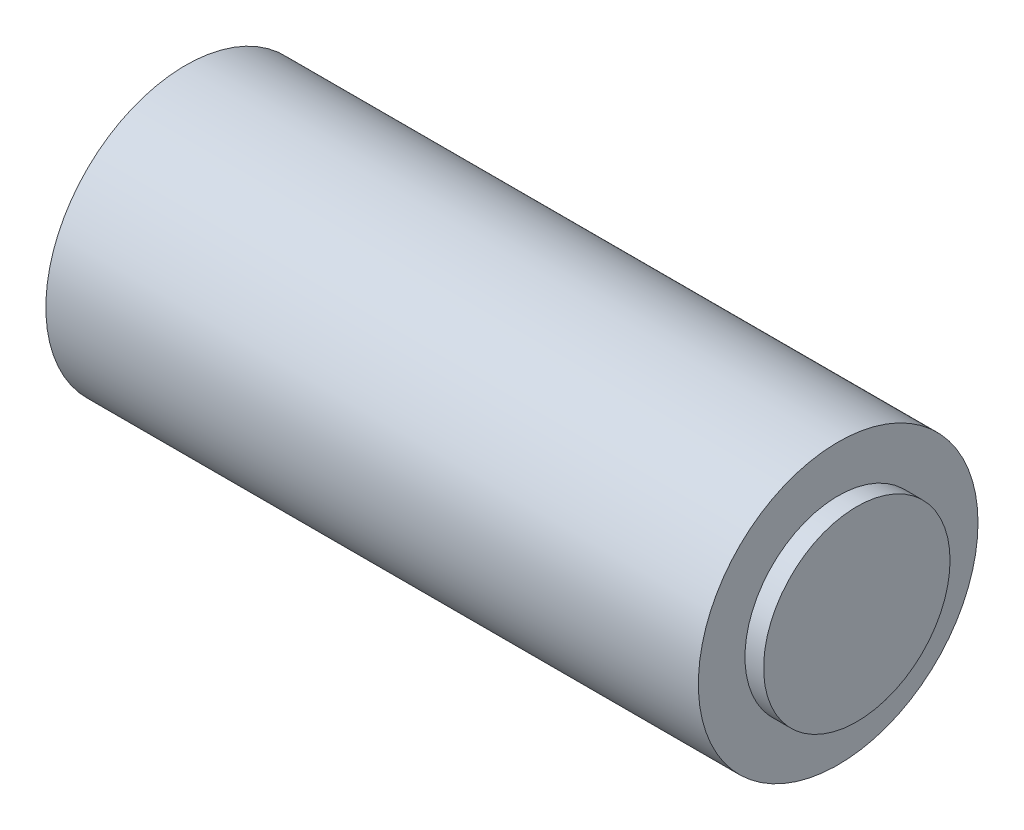
ISO-10303-21;
HEADER;
FILE_DESCRIPTION(('STEP AP214'),'2;1');
FILE_NAME('part.step','',(''),(''),'','','');
FILE_SCHEMA(('AUTOMOTIVE_DESIGN { 1 0 10303 214 1 1 1 1 }'));
ENDSEC;
DATA;
#1=APPLICATION_CONTEXT('core data for automotive mechanical design processes');
#2=APPLICATION_PROTOCOL_DEFINITION('international standard','automotive_design',2000,#1);
#3=PRODUCT_CONTEXT('',#1,'mechanical');
#4=PRODUCT('Part','Part','',(#3));
#5=PRODUCT_RELATED_PRODUCT_CATEGORY('part','',(#4));
#6=PRODUCT_DEFINITION_FORMATION('','',#4);
#7=PRODUCT_DEFINITION_CONTEXT('part definition',#1,'design');
#8=PRODUCT_DEFINITION('design','',#6,#7);
#9=PRODUCT_DEFINITION_SHAPE('','',#8);
#10=(LENGTH_UNIT() NAMED_UNIT(*) SI_UNIT(.MILLI.,.METRE.));
#11=(NAMED_UNIT(*) PLANE_ANGLE_UNIT() SI_UNIT($,.RADIAN.));
#12=(NAMED_UNIT(*) SI_UNIT($,.STERADIAN.) SOLID_ANGLE_UNIT());
#13=UNCERTAINTY_MEASURE_WITH_UNIT(LENGTH_MEASURE(1.E-05),#10,'distance_accuracy_value','');
#14=(GEOMETRIC_REPRESENTATION_CONTEXT(3) GLOBAL_UNCERTAINTY_ASSIGNED_CONTEXT((#13)) GLOBAL_UNIT_ASSIGNED_CONTEXT((#10,
#11,#12)) REPRESENTATION_CONTEXT('',''));
#15=CARTESIAN_POINT('',(0.,0.,0.));
#16=DIRECTION('',(0.,0.,1.));
#17=DIRECTION('',(1.,0.,0.));
#18=AXIS2_PLACEMENT_3D('',#15,#16,#17);
#19=CARTESIAN_POINT('',(0.,0.,0.));
#20=DIRECTION('',(1.,0.,0.));
#21=DIRECTION('',(0.,0.,-1.));
#22=AXIS2_PLACEMENT_3D('',#19,#20,#21);
#23=PLANE('',#22);
#24=CARTESIAN_POINT('',(0.,0.,0.));
#25=DIRECTION('',(1.,0.,0.));
#26=DIRECTION('',(0.,0.,-1.));
#27=AXIS2_PLACEMENT_3D('',#24,#25,#26);
#28=CIRCLE('',#27,5.);
#29=CARTESIAN_POINT('',(0.,0.,-5.));
#30=VERTEX_POINT('',#29);
#31=EDGE_CURVE('E10',#30,#30,#28,.T.);
#32=ORIENTED_EDGE('',*,*,#31,.F.);
#33=EDGE_LOOP('',(#32));
#34=FACE_BOUND('',#33,.T.);
#35=ADVANCED_FACE('F49',(#34),#23,.F.);
#36=CARTESIAN_POINT('',(35.,0.,0.));
#37=DIRECTION('',(1.,0.,0.));
#38=DIRECTION('',(0.,0.,-1.));
#39=AXIS2_PLACEMENT_3D('',#36,#37,#38);
#40=CYLINDRICAL_SURFACE('',#39,5.);
#41=CARTESIAN_POINT('',(-1.,0.,0.));
#42=DIRECTION('',(1.,0.,0.));
#43=DIRECTION('',(0.,0.,-1.));
#44=AXIS2_PLACEMENT_3D('',#41,#42,#43);
#45=CIRCLE('',#44,5.);
#46=CARTESIAN_POINT('',(-1.,0.,-5.));
#47=VERTEX_POINT('',#46);
#48=EDGE_CURVE('E56',#47,#47,#45,.T.);
#49=ORIENTED_EDGE('',*,*,#48,.F.);
#50=EDGE_LOOP('',(#49));
#51=FACE_BOUND('',#50,.T.);
#52=ORIENTED_EDGE('',*,*,#31,.T.);
#53=EDGE_LOOP('',(#52));
#54=FACE_BOUND('',#53,.T.);
#55=ADVANCED_FACE('F104',(#51,#54),#40,.F.);
#56=CARTESIAN_POINT('',(-0.999999999999999,0.,5.));
#57=DIRECTION('',(1.,0.,0.));
#58=DIRECTION('',(0.,0.,-1.));
#59=AXIS2_PLACEMENT_3D('',#56,#57,#58);
#60=PLANE('',#59);
#61=CARTESIAN_POINT('',(-1.,0.,0.));
#62=DIRECTION('',(1.,0.,0.));
#63=DIRECTION('',(0.,0.,-1.));
#64=AXIS2_PLACEMENT_3D('',#61,#62,#63);
#65=CIRCLE('',#64,7.5);
#66=CARTESIAN_POINT('',(-1.,0.,-7.5));
#67=VERTEX_POINT('',#66);
#68=EDGE_CURVE('E61',#67,#67,#65,.T.);
#69=ORIENTED_EDGE('',*,*,#68,.F.);
#70=EDGE_LOOP('',(#69));
#71=FACE_BOUND('',#70,.T.);
#72=ORIENTED_EDGE('',*,*,#48,.T.);
#73=EDGE_LOOP('',(#72));
#74=FACE_BOUND('',#73,.T.);
#75=ADVANCED_FACE('F99',(#71,#74),#60,.F.);
#76=CARTESIAN_POINT('',(35.,0.,0.));
#77=DIRECTION('',(1.,0.,0.));
#78=DIRECTION('',(0.,0.,-1.));
#79=AXIS2_PLACEMENT_3D('',#76,#77,#78);
#80=CYLINDRICAL_SURFACE('',#79,7.5);
#81=CARTESIAN_POINT('',(34.,0.,0.));
#82=DIRECTION('',(1.,0.,0.));
#83=DIRECTION('',(0.,0.,-1.));
#84=AXIS2_PLACEMENT_3D('',#81,#82,#83);
#85=CIRCLE('',#84,7.5);
#86=CARTESIAN_POINT('',(34.,0.,-7.5));
#87=VERTEX_POINT('',#86);
#88=EDGE_CURVE('E66',#87,#87,#85,.T.);
#89=ORIENTED_EDGE('',*,*,#88,.F.);
#90=EDGE_LOOP('',(#89));
#91=FACE_BOUND('',#90,.T.);
#92=ORIENTED_EDGE('',*,*,#68,.T.);
#93=EDGE_LOOP('',(#92));
#94=FACE_BOUND('',#93,.T.);
#95=ADVANCED_FACE('F93',(#91,#94),#80,.T.);
#96=CARTESIAN_POINT('',(34.,0.,7.5));
#97=DIRECTION('',(-1.,0.,0.));
#98=DIRECTION('',(0.,0.,1.));
#99=AXIS2_PLACEMENT_3D('',#96,#97,#98);
#100=PLANE('',#99);
#101=CARTESIAN_POINT('',(34.,0.,0.));
#102=DIRECTION('',(1.,0.,0.));
#103=DIRECTION('',(0.,0.,-1.));
#104=AXIS2_PLACEMENT_3D('',#101,#102,#103);
#105=CIRCLE('',#104,5.);
#106=CARTESIAN_POINT('',(34.,0.,-5.));
#107=VERTEX_POINT('',#106);
#108=EDGE_CURVE('E72',#107,#107,#105,.T.);
#109=ORIENTED_EDGE('',*,*,#108,.F.);
#110=EDGE_LOOP('',(#109));
#111=FACE_BOUND('',#110,.T.);
#112=ORIENTED_EDGE('',*,*,#88,.T.);
#113=EDGE_LOOP('',(#112));
#114=FACE_BOUND('',#113,.T.);
#115=ADVANCED_FACE('F87',(#111,#114),#100,.F.);
#116=CARTESIAN_POINT('',(35.,0.,0.));
#117=DIRECTION('',(1.,0.,0.));
#118=DIRECTION('',(0.,0.,-1.));
#119=AXIS2_PLACEMENT_3D('',#116,#117,#118);
#120=CYLINDRICAL_SURFACE('',#119,5.);
#121=CARTESIAN_POINT('',(35.,0.,0.));
#122=DIRECTION('',(1.,0.,0.));
#123=DIRECTION('',(0.,0.,-1.));
#124=AXIS2_PLACEMENT_3D('',#121,#122,#123);
#125=CIRCLE('',#124,5.);
#126=CARTESIAN_POINT('',(35.,0.,-5.));
#127=VERTEX_POINT('',#126);
#128=EDGE_CURVE('E76',#127,#127,#125,.T.);
#129=ORIENTED_EDGE('',*,*,#128,.F.);
#130=EDGE_LOOP('',(#129));
#131=FACE_BOUND('',#130,.T.);
#132=ORIENTED_EDGE('',*,*,#108,.T.);
#133=EDGE_LOOP('',(#132));
#134=FACE_BOUND('',#133,.T.);
#135=ADVANCED_FACE('F84',(#131,#134),#120,.T.);
#136=CARTESIAN_POINT('',(35.,0.,5.));
#137=DIRECTION('',(-1.,0.,0.));
#138=DIRECTION('',(0.,0.,1.));
#139=AXIS2_PLACEMENT_3D('',#136,#137,#138);
#140=PLANE('',#139);
#141=ORIENTED_EDGE('',*,*,#128,.T.);
#142=EDGE_LOOP('',(#141));
#143=FACE_BOUND('',#142,.T.);
#144=ADVANCED_FACE('F82',(#143),#140,.F.);
#145=CLOSED_SHELL('',(#35,#55,#75,#95,#115,#135,#144));
#146=MANIFOLD_SOLID_BREP('B2',#145);
#147=ADVANCED_BREP_SHAPE_REPRESENTATION('',(#18,#146),#14);
#148=SHAPE_DEFINITION_REPRESENTATION(#9,#147);
ENDSEC;
END-ISO-10303-21;
